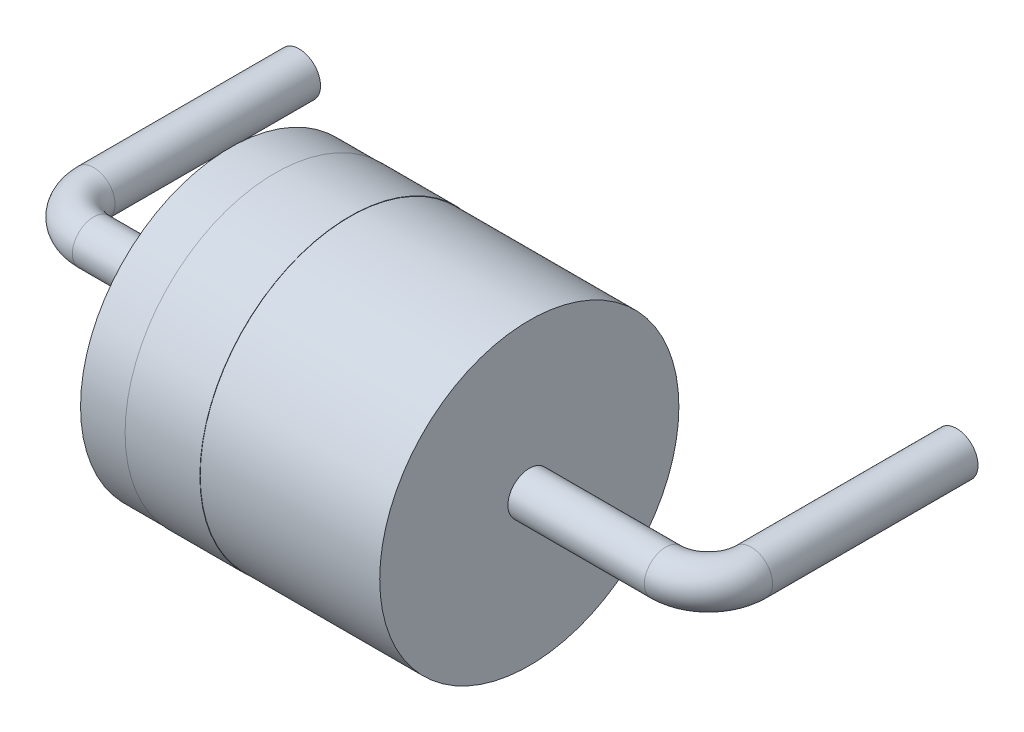
ISO-10303-21;
HEADER;
FILE_DESCRIPTION(('STEP AP214'),'2;1');
FILE_NAME('part.step','',(''),(''),'','','');
FILE_SCHEMA(('AUTOMOTIVE_DESIGN { 1 0 10303 214 1 1 1 1 }'));
ENDSEC;
DATA;
#1=APPLICATION_CONTEXT('core data for automotive mechanical design processes');
#2=APPLICATION_PROTOCOL_DEFINITION('international standard','automotive_design',2000,#1);
#3=PRODUCT_CONTEXT('',#1,'mechanical');
#4=PRODUCT('Part','Part','',(#3));
#5=PRODUCT_RELATED_PRODUCT_CATEGORY('part','',(#4));
#6=PRODUCT_DEFINITION_FORMATION('','',#4);
#7=PRODUCT_DEFINITION_CONTEXT('part definition',#1,'design');
#8=PRODUCT_DEFINITION('design','',#6,#7);
#9=PRODUCT_DEFINITION_SHAPE('','',#8);
#10=(LENGTH_UNIT() NAMED_UNIT(*) SI_UNIT(.MILLI.,.METRE.));
#11=(NAMED_UNIT(*) PLANE_ANGLE_UNIT() SI_UNIT($,.RADIAN.));
#12=(NAMED_UNIT(*) SI_UNIT($,.STERADIAN.) SOLID_ANGLE_UNIT());
#13=UNCERTAINTY_MEASURE_WITH_UNIT(LENGTH_MEASURE(1.E-05),#10,'distance_accuracy_value','');
#14=(GEOMETRIC_REPRESENTATION_CONTEXT(3) GLOBAL_UNCERTAINTY_ASSIGNED_CONTEXT((#13)) GLOBAL_UNIT_ASSIGNED_CONTEXT((#10,
#11,#12)) REPRESENTATION_CONTEXT('',''));
#15=CARTESIAN_POINT('',(0.,0.,0.));
#16=DIRECTION('',(0.,0.,1.));
#17=DIRECTION('',(1.,0.,0.));
#18=AXIS2_PLACEMENT_3D('',#15,#16,#17);
#19=CARTESIAN_POINT('',(19.35,0.,-2.5));
#20=DIRECTION('',(0.,0.,1.));
#21=DIRECTION('',(1.,0.,0.));
#22=AXIS2_PLACEMENT_3D('',#19,#20,#21);
#23=PLANE('',#22);
#24=CARTESIAN_POINT('',(20.,0.,-2.5));
#25=DIRECTION('',(0.,0.,-1.));
#26=DIRECTION('',(-1.,0.,0.));
#27=AXIS2_PLACEMENT_3D('',#24,#25,#26);
#28=CIRCLE('',#27,0.65);
#29=CARTESIAN_POINT('',(19.35,0.,-2.5));
#30=VERTEX_POINT('',#29);
#31=EDGE_CURVE('E11',#30,#30,#28,.T.);
#32=ORIENTED_EDGE('',*,*,#31,.T.);
#33=EDGE_LOOP('',(#32));
#34=FACE_BOUND('',#33,.T.);
#35=ADVANCED_FACE('F17',(#34),#23,.F.);
#36=CARTESIAN_POINT('',(20.,0.,3.75));
#37=DIRECTION('',(0.,0.,-1.));
#38=DIRECTION('',(-1.,0.,0.));
#39=AXIS2_PLACEMENT_3D('',#36,#37,#38);
#40=CYLINDRICAL_SURFACE('',#39,0.65);
#41=DIRECTION('',(0.,0.,-1.));
#42=VECTOR('',#41,1.);
#43=CARTESIAN_POINT('',(19.35,0.,3.75));
#44=LINE('',#43,#42);
#45=CARTESIAN_POINT('',(19.35,0.,3.75));
#46=VERTEX_POINT('',#45);
#47=EDGE_CURVE('E28',#46,#30,#44,.T.);
#48=ORIENTED_EDGE('',*,*,#47,.T.);
#49=ORIENTED_EDGE('',*,*,#31,.F.);
#50=ORIENTED_EDGE('',*,*,#47,.F.);
#51=CARTESIAN_POINT('',(20.,0.,3.75));
#52=DIRECTION('',(0.,0.,1.));
#53=DIRECTION('',(1.,0.,0.));
#54=AXIS2_PLACEMENT_3D('',#51,#52,#53);
#55=CIRCLE('',#54,0.65);
#56=EDGE_CURVE('E21',#46,#46,#55,.T.);
#57=ORIENTED_EDGE('',*,*,#56,.F.);
#58=EDGE_LOOP('',(#48,#49,#50,#57));
#59=FACE_BOUND('',#58,.T.);
#60=ADVANCED_FACE('F19',(#59),#40,.T.);
#61=CARTESIAN_POINT('',(18.7,0.,3.75));
#62=DIRECTION('',(0.,1.,0.));
#63=DIRECTION('',(1.,0.,0.));
#64=AXIS2_PLACEMENT_3D('',#61,#62,#63);
#65=TOROIDAL_SURFACE('',#64,1.3,0.65);
#66=CARTESIAN_POINT('',(18.7,0.,3.75));
#67=DIRECTION('',(0.,1.,0.));
#68=DIRECTION('',(1.,0.,0.));
#69=AXIS2_PLACEMENT_3D('',#66,#67,#68);
#70=CIRCLE('',#69,0.65);
#71=CARTESIAN_POINT('',(18.7,0.,4.4));
#72=VERTEX_POINT('',#71);
#73=EDGE_CURVE('E155',#72,#46,#70,.T.);
#74=ORIENTED_EDGE('',*,*,#73,.T.);
#75=ORIENTED_EDGE('',*,*,#56,.T.);
#76=ORIENTED_EDGE('',*,*,#73,.F.);
#77=CARTESIAN_POINT('',(18.7,0.,5.05));
#78=DIRECTION('',(1.,0.,0.));
#79=DIRECTION('',(0.,0.,-1.));
#80=AXIS2_PLACEMENT_3D('',#77,#78,#79);
#81=CIRCLE('',#80,0.65);
#82=EDGE_CURVE('E151',#72,#72,#81,.T.);
#83=ORIENTED_EDGE('',*,*,#82,.T.);
#84=EDGE_LOOP('',(#74,#75,#76,#83));
#85=FACE_BOUND('',#84,.T.);
#86=ADVANCED_FACE('F211',(#85),#65,.T.);
#87=CARTESIAN_POINT('',(1.3,0.,5.05));
#88=DIRECTION('',(1.,0.,0.));
#89=DIRECTION('',(0.,0.,-1.));
#90=AXIS2_PLACEMENT_3D('',#87,#88,#89);
#91=CYLINDRICAL_SURFACE('',#90,0.65);
#92=CARTESIAN_POINT('',(14.55,0.,5.05));
#93=DIRECTION('',(1.,0.,0.));
#94=DIRECTION('',(0.,0.,-1.));
#95=AXIS2_PLACEMENT_3D('',#92,#93,#94);
#96=CIRCLE('',#95,0.65);
#97=CARTESIAN_POINT('',(14.55,0.,4.4));
#98=VERTEX_POINT('',#97);
#99=EDGE_CURVE('E140',#98,#98,#96,.T.);
#100=ORIENTED_EDGE('',*,*,#99,.T.);
#101=DIRECTION('',(1.,0.,0.));
#102=VECTOR('',#101,1.);
#103=CARTESIAN_POINT('',(1.3,0.,4.4));
#104=LINE('',#103,#102);
#105=EDGE_CURVE('E144',#98,#72,#104,.T.);
#106=ORIENTED_EDGE('',*,*,#105,.T.);
#107=ORIENTED_EDGE('',*,*,#82,.F.);
#108=ORIENTED_EDGE('',*,*,#105,.F.);
#109=EDGE_LOOP('',(#100,#106,#107,#108));
#110=FACE_BOUND('',#109,.T.);
#111=ADVANCED_FACE('F214',(#110),#91,.T.);
#112=CARTESIAN_POINT('',(14.55,0.,5.05));
#113=DIRECTION('',(1.,0.,0.));
#114=DIRECTION('',(0.,1.,0.));
#115=AXIS2_PLACEMENT_3D('',#112,#113,#114);
#116=PLANE('',#115);
#117=ORIENTED_EDGE('',*,*,#99,.F.);
#118=EDGE_LOOP('',(#117));
#119=FACE_BOUND('',#118,.T.);
#120=CARTESIAN_POINT('',(14.55,0.,5.05));
#121=DIRECTION('',(1.,0.,0.));
#122=DIRECTION('',(0.,0.,1.));
#123=AXIS2_PLACEMENT_3D('',#120,#121,#122);
#124=CIRCLE('',#123,4.55);
#125=CARTESIAN_POINT('',(14.55,0.,9.6));
#126=VERTEX_POINT('',#125);
#127=EDGE_CURVE('E145',#126,#126,#124,.T.);
#128=ORIENTED_EDGE('',*,*,#127,.T.);
#129=EDGE_LOOP('',(#128));
#130=FACE_BOUND('',#129,.T.);
#131=ADVANCED_FACE('F175',(#119,#130),#116,.T.);
#132=CARTESIAN_POINT('',(5.45,0.,5.05));
#133=DIRECTION('',(1.,0.,0.));
#134=DIRECTION('',(0.,0.,1.));
#135=AXIS2_PLACEMENT_3D('',#132,#133,#134);
#136=CYLINDRICAL_SURFACE('',#135,4.55);
#137=CARTESIAN_POINT('',(9.09,0.,5.05));
#138=DIRECTION('',(1.,0.,0.));
#139=DIRECTION('',(0.,0.,1.));
#140=AXIS2_PLACEMENT_3D('',#137,#138,#139);
#141=CIRCLE('',#140,4.55);
#142=CARTESIAN_POINT('',(9.09,0.,9.6));
#143=VERTEX_POINT('',#142);
#144=EDGE_CURVE('E132',#143,#143,#141,.T.);
#145=ORIENTED_EDGE('',*,*,#144,.T.);
#146=DIRECTION('',(1.,0.,0.));
#147=VECTOR('',#146,1.);
#148=CARTESIAN_POINT('',(5.45,0.,9.6));
#149=LINE('',#148,#147);
#150=EDGE_CURVE('E139',#143,#126,#149,.T.);
#151=ORIENTED_EDGE('',*,*,#150,.T.);
#152=ORIENTED_EDGE('',*,*,#127,.F.);
#153=ORIENTED_EDGE('',*,*,#150,.F.);
#154=EDGE_LOOP('',(#145,#151,#152,#153));
#155=FACE_BOUND('',#154,.T.);
#156=ADVANCED_FACE('F177',(#155),#136,.T.);
#157=CARTESIAN_POINT('',(9.09,0.,5.05));
#158=DIRECTION('',(1.,0.,0.));
#159=DIRECTION('',(0.,1.,0.));
#160=AXIS2_PLACEMENT_3D('',#157,#158,#159);
#161=PLANE('',#160);
#162=ORIENTED_EDGE('',*,*,#144,.F.);
#163=EDGE_LOOP('',(#162));
#164=FACE_BOUND('',#163,.T.);
#165=CARTESIAN_POINT('',(9.09,0.,5.05));
#166=DIRECTION('',(1.,0.,0.));
#167=DIRECTION('',(0.,0.,1.));
#168=AXIS2_PLACEMENT_3D('',#165,#166,#167);
#169=CIRCLE('',#168,4.56);
#170=CARTESIAN_POINT('',(9.09,0.,9.61));
#171=VERTEX_POINT('',#170);
#172=EDGE_CURVE('E129',#171,#171,#169,.T.);
#173=ORIENTED_EDGE('',*,*,#172,.T.);
#174=EDGE_LOOP('',(#173));
#175=FACE_BOUND('',#174,.T.);
#176=ADVANCED_FACE('F180',(#164,#175),#161,.T.);
#177=CARTESIAN_POINT('',(6.815,0.,5.05));
#178=DIRECTION('',(1.,0.,0.));
#179=DIRECTION('',(0.,0.,1.));
#180=AXIS2_PLACEMENT_3D('',#177,#178,#179);
#181=CYLINDRICAL_SURFACE('',#180,4.56);
#182=CARTESIAN_POINT('',(6.815,0.,5.05));
#183=DIRECTION('',(1.,0.,0.));
#184=DIRECTION('',(0.,0.,1.));
#185=AXIS2_PLACEMENT_3D('',#182,#183,#184);
#186=CIRCLE('',#185,4.56);
#187=CARTESIAN_POINT('',(6.815,0.,9.61));
#188=VERTEX_POINT('',#187);
#189=EDGE_CURVE('E121',#188,#188,#186,.T.);
#190=ORIENTED_EDGE('',*,*,#189,.T.);
#191=DIRECTION('',(1.,0.,0.));
#192=VECTOR('',#191,1.);
#193=CARTESIAN_POINT('',(6.815,0.,9.61));
#194=LINE('',#193,#192);
#195=EDGE_CURVE('E133',#188,#171,#194,.T.);
#196=ORIENTED_EDGE('',*,*,#195,.T.);
#197=ORIENTED_EDGE('',*,*,#172,.F.);
#198=ORIENTED_EDGE('',*,*,#195,.F.);
#199=EDGE_LOOP('',(#190,#196,#197,#198));
#200=FACE_BOUND('',#199,.T.);
#201=ADVANCED_FACE('F183',(#200),#181,.T.);
#202=CARTESIAN_POINT('',(6.815,0.,5.05));
#203=DIRECTION('',(1.,0.,0.));
#204=DIRECTION('',(0.,1.,0.));
#205=AXIS2_PLACEMENT_3D('',#202,#203,#204);
#206=PLANE('',#205);
#207=CARTESIAN_POINT('',(6.815,0.,5.05));
#208=DIRECTION('',(1.,0.,0.));
#209=DIRECTION('',(0.,0.,1.));
#210=AXIS2_PLACEMENT_3D('',#207,#208,#209);
#211=CIRCLE('',#210,4.55);
#212=CARTESIAN_POINT('',(6.815,0.,9.6));
#213=VERTEX_POINT('',#212);
#214=EDGE_CURVE('E114',#213,#213,#211,.T.);
#215=ORIENTED_EDGE('',*,*,#214,.T.);
#216=EDGE_LOOP('',(#215));
#217=FACE_BOUND('',#216,.T.);
#218=ORIENTED_EDGE('',*,*,#189,.F.);
#219=EDGE_LOOP('',(#218));
#220=FACE_BOUND('',#219,.T.);
#221=ADVANCED_FACE('F188',(#217,#220),#206,.F.);
#222=CARTESIAN_POINT('',(5.45,0.,5.05));
#223=DIRECTION('',(1.,0.,0.));
#224=DIRECTION('',(0.,0.,1.));
#225=AXIS2_PLACEMENT_3D('',#222,#223,#224);
#226=CYLINDRICAL_SURFACE('',#225,4.55);
#227=DIRECTION('',(1.,0.,0.));
#228=VECTOR('',#227,1.);
#229=CARTESIAN_POINT('',(5.45,0.,9.6));
#230=LINE('',#229,#228);
#231=CARTESIAN_POINT('',(5.45,0.,9.6));
#232=VERTEX_POINT('',#231);
#233=EDGE_CURVE('E111',#232,#213,#230,.T.);
#234=ORIENTED_EDGE('',*,*,#233,.F.);
#235=CARTESIAN_POINT('',(5.45,0.,5.05));
#236=DIRECTION('',(1.,0.,0.));
#237=DIRECTION('',(0.,0.,1.));
#238=AXIS2_PLACEMENT_3D('',#235,#236,#237);
#239=CIRCLE('',#238,4.55);
#240=EDGE_CURVE('E115',#232,#232,#239,.T.);
#241=ORIENTED_EDGE('',*,*,#240,.T.);
#242=ORIENTED_EDGE('',*,*,#233,.T.);
#243=ORIENTED_EDGE('',*,*,#214,.F.);
#244=EDGE_LOOP('',(#234,#241,#242,#243));
#245=FACE_BOUND('',#244,.T.);
#246=ADVANCED_FACE('F190',(#245),#226,.T.);
#247=CARTESIAN_POINT('',(5.45,0.,5.05));
#248=DIRECTION('',(1.,0.,0.));
#249=DIRECTION('',(0.,1.,0.));
#250=AXIS2_PLACEMENT_3D('',#247,#248,#249);
#251=PLANE('',#250);
#252=CARTESIAN_POINT('',(5.45,0.,5.05));
#253=DIRECTION('',(1.,0.,0.));
#254=DIRECTION('',(0.,0.,-1.));
#255=AXIS2_PLACEMENT_3D('',#252,#253,#254);
#256=CIRCLE('',#255,0.65);
#257=CARTESIAN_POINT('',(5.45,0.,4.4));
#258=VERTEX_POINT('',#257);
#259=EDGE_CURVE('E126',#258,#258,#256,.T.);
#260=ORIENTED_EDGE('',*,*,#259,.T.);
#261=EDGE_LOOP('',(#260));
#262=FACE_BOUND('',#261,.T.);
#263=ORIENTED_EDGE('',*,*,#240,.F.);
#264=EDGE_LOOP('',(#263));
#265=FACE_BOUND('',#264,.T.);
#266=ADVANCED_FACE('F198',(#262,#265),#251,.F.);
#267=CARTESIAN_POINT('',(1.3,0.,5.05));
#268=DIRECTION('',(1.,0.,0.));
#269=DIRECTION('',(0.,0.,-1.));
#270=AXIS2_PLACEMENT_3D('',#267,#268,#269);
#271=CYLINDRICAL_SURFACE('',#270,0.65);
#272=CARTESIAN_POINT('',(1.3,0.,5.05));
#273=DIRECTION('',(-1.,0.,0.));
#274=DIRECTION('',(0.,0.,1.));
#275=AXIS2_PLACEMENT_3D('',#272,#273,#274);
#276=CIRCLE('',#275,0.65);
#277=CARTESIAN_POINT('',(1.3,0.,4.4));
#278=VERTEX_POINT('',#277);
#279=EDGE_CURVE('E100',#278,#278,#276,.T.);
#280=ORIENTED_EDGE('',*,*,#279,.F.);
#281=DIRECTION('',(1.,0.,0.));
#282=VECTOR('',#281,1.);
#283=CARTESIAN_POINT('',(1.3,0.,4.4));
#284=LINE('',#283,#282);
#285=EDGE_CURVE('E88',#278,#258,#284,.T.);
#286=ORIENTED_EDGE('',*,*,#285,.T.);
#287=ORIENTED_EDGE('',*,*,#259,.F.);
#288=ORIENTED_EDGE('',*,*,#285,.F.);
#289=EDGE_LOOP('',(#280,#286,#287,#288));
#290=FACE_BOUND('',#289,.T.);
#291=ADVANCED_FACE('F225',(#290),#271,.T.);
#292=CARTESIAN_POINT('',(1.3,0.,3.75));
#293=DIRECTION('',(0.,1.,0.));
#294=DIRECTION('',(1.,0.,0.));
#295=AXIS2_PLACEMENT_3D('',#292,#293,#294);
#296=TOROIDAL_SURFACE('',#295,1.3,0.65);
#297=CARTESIAN_POINT('',(1.3,0.,3.75));
#298=DIRECTION('',(0.,1.,0.));
#299=DIRECTION('',(1.,0.,0.));
#300=AXIS2_PLACEMENT_3D('',#297,#298,#299);
#301=CIRCLE('',#300,0.65);
#302=CARTESIAN_POINT('',(0.65,0.,3.75));
#303=VERTEX_POINT('',#302);
#304=EDGE_CURVE('E96',#303,#278,#301,.T.);
#305=ORIENTED_EDGE('',*,*,#304,.T.);
#306=ORIENTED_EDGE('',*,*,#279,.T.);
#307=ORIENTED_EDGE('',*,*,#304,.F.);
#308=CARTESIAN_POINT('',(0.,0.,3.75));
#309=DIRECTION('',(0.,0.,1.));
#310=DIRECTION('',(1.,0.,0.));
#311=AXIS2_PLACEMENT_3D('',#308,#309,#310);
#312=CIRCLE('',#311,0.65);
#313=EDGE_CURVE('E99',#303,#303,#312,.T.);
#314=ORIENTED_EDGE('',*,*,#313,.T.);
#315=EDGE_LOOP('',(#305,#306,#307,#314));
#316=FACE_BOUND('',#315,.T.);
#317=ADVANCED_FACE('F97',(#316),#296,.T.);
#318=CARTESIAN_POINT('',(0.65,0.,-2.5));
#319=DIRECTION('',(0.,0.,-1.));
#320=DIRECTION('',(0.,-1.,0.));
#321=AXIS2_PLACEMENT_3D('',#318,#319,#320);
#322=PLANE('',#321);
#323=CARTESIAN_POINT('',(0.,0.,-2.5));
#324=DIRECTION('',(0.,0.,1.));
#325=DIRECTION('',(1.,0.,0.));
#326=AXIS2_PLACEMENT_3D('',#323,#324,#325);
#327=CIRCLE('',#326,0.65);
#328=CARTESIAN_POINT('',(0.65,0.,-2.5));
#329=VERTEX_POINT('',#328);
#330=EDGE_CURVE('E102',#329,#329,#327,.T.);
#331=ORIENTED_EDGE('',*,*,#330,.F.);
#332=EDGE_LOOP('',(#331));
#333=FACE_BOUND('',#332,.T.);
#334=ADVANCED_FACE('F220',(#333),#322,.T.);
#335=CARTESIAN_POINT('',(0.,0.,3.75));
#336=DIRECTION('',(0.,0.,1.));
#337=DIRECTION('',(1.,0.,0.));
#338=AXIS2_PLACEMENT_3D('',#335,#336,#337);
#339=CYLINDRICAL_SURFACE('',#338,0.65);
#340=DIRECTION('',(0.,0.,1.));
#341=VECTOR('',#340,1.);
#342=CARTESIAN_POINT('',(0.65,0.,3.75));
#343=LINE('',#342,#341);
#344=EDGE_CURVE('E122',#329,#303,#343,.T.);
#345=ORIENTED_EDGE('',*,*,#344,.T.);
#346=ORIENTED_EDGE('',*,*,#313,.F.);
#347=ORIENTED_EDGE('',*,*,#344,.F.);
#348=ORIENTED_EDGE('',*,*,#330,.T.);
#349=EDGE_LOOP('',(#345,#346,#347,#348));
#350=FACE_BOUND('',#349,.T.);
#351=ADVANCED_FACE('F223',(#350),#339,.T.);
#352=CLOSED_SHELL('',(#35,#60,#86,#111,#131,#156,#176,#201,#221,#246,#266,#291,#317,#334,#351));
#353=MANIFOLD_SOLID_BREP('B1',#352);
#354=ADVANCED_BREP_SHAPE_REPRESENTATION('',(#18,#353),#14);
#355=SHAPE_DEFINITION_REPRESENTATION(#9,#354);
ENDSEC;
END-ISO-10303-21;
